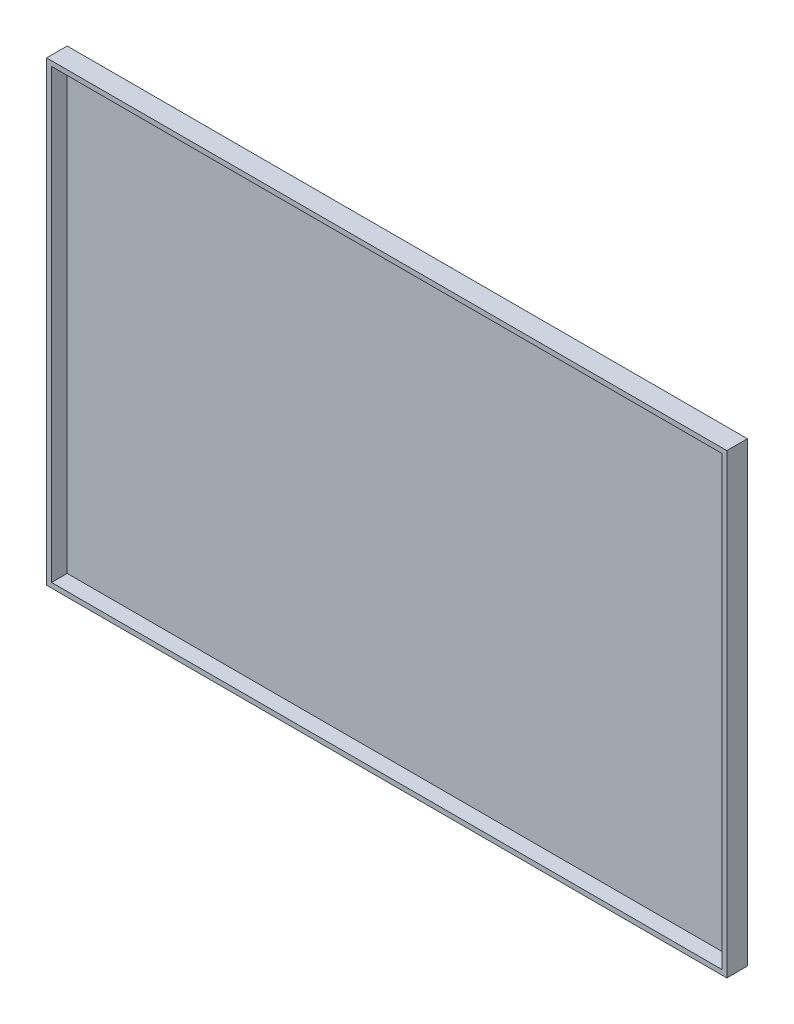
ISO-10303-21;
HEADER;
FILE_DESCRIPTION(('STEP AP214'),'2;1');
FILE_NAME('part.step','',(''),(''),'','','');
FILE_SCHEMA(('AUTOMOTIVE_DESIGN { 1 0 10303 214 1 1 1 1 }'));
ENDSEC;
DATA;
#1=APPLICATION_CONTEXT('core data for automotive mechanical design processes');
#2=APPLICATION_PROTOCOL_DEFINITION('international standard','automotive_design',2000,#1);
#3=PRODUCT_CONTEXT('',#1,'mechanical');
#4=PRODUCT('Part','Part','',(#3));
#5=PRODUCT_RELATED_PRODUCT_CATEGORY('part','',(#4));
#6=PRODUCT_DEFINITION_FORMATION('','',#4);
#7=PRODUCT_DEFINITION_CONTEXT('part definition',#1,'design');
#8=PRODUCT_DEFINITION('design','',#6,#7);
#9=PRODUCT_DEFINITION_SHAPE('','',#8);
#10=(LENGTH_UNIT() NAMED_UNIT(*) SI_UNIT(.MILLI.,.METRE.));
#11=(NAMED_UNIT(*) PLANE_ANGLE_UNIT() SI_UNIT($,.RADIAN.));
#12=(NAMED_UNIT(*) SI_UNIT($,.STERADIAN.) SOLID_ANGLE_UNIT());
#13=UNCERTAINTY_MEASURE_WITH_UNIT(LENGTH_MEASURE(1.E-05),#10,'distance_accuracy_value','');
#14=(GEOMETRIC_REPRESENTATION_CONTEXT(3) GLOBAL_UNCERTAINTY_ASSIGNED_CONTEXT((#13)) GLOBAL_UNIT_ASSIGNED_CONTEXT((#10,
#11,#12)) REPRESENTATION_CONTEXT('',''));
#15=CARTESIAN_POINT('',(0.,0.,0.));
#16=DIRECTION('',(0.,0.,1.));
#17=DIRECTION('',(1.,0.,0.));
#18=AXIS2_PLACEMENT_3D('',#15,#16,#17);
#19=CARTESIAN_POINT('',(-3241.27891156463,1394.34013605442,92.));
#20=DIRECTION('',(1.,0.,0.));
#21=DIRECTION('',(0.,0.,-1.));
#22=AXIS2_PLACEMENT_3D('',#19,#20,#21);
#23=PLANE('',#22);
#24=DIRECTION('',(0.,-1.,0.));
#25=VECTOR('',#24,1.);
#26=CARTESIAN_POINT('',(-3241.27891156463,1394.34013605442,0.));
#27=LINE('',#26,#25);
#28=CARTESIAN_POINT('',(-3241.27891156463,1394.34013605442,0.));
#29=VERTEX_POINT('',#28);
#30=CARTESIAN_POINT('',(-3241.27891156463,-649.659863945578,0.));
#31=VERTEX_POINT('',#30);
#32=EDGE_CURVE('E140',#29,#31,#27,.T.);
#33=ORIENTED_EDGE('',*,*,#32,.T.);
#34=DIRECTION('',(0.,0.,-1.));
#35=VECTOR('',#34,1.);
#36=CARTESIAN_POINT('',(-3241.27891156463,-649.659863945578,92.));
#37=LINE('',#36,#35);
#38=CARTESIAN_POINT('',(-3241.27891156463,-649.659863945578,92.));
#39=VERTEX_POINT('',#38);
#40=EDGE_CURVE('E11',#39,#31,#37,.T.);
#41=ORIENTED_EDGE('',*,*,#40,.F.);
#42=DIRECTION('',(0.,-1.,0.));
#43=VECTOR('',#42,1.);
#44=CARTESIAN_POINT('',(-3241.27891156463,1394.34013605442,92.));
#45=LINE('',#44,#43);
#46=CARTESIAN_POINT('',(-3241.27891156463,1394.34013605442,92.));
#47=VERTEX_POINT('',#46);
#48=EDGE_CURVE('E144',#47,#39,#45,.T.);
#49=ORIENTED_EDGE('',*,*,#48,.F.);
#50=DIRECTION('',(0.,0.,-1.));
#51=VECTOR('',#50,1.);
#52=CARTESIAN_POINT('',(-3241.27891156463,1394.34013605442,92.));
#53=LINE('',#52,#51);
#54=EDGE_CURVE('E150',#47,#29,#53,.T.);
#55=ORIENTED_EDGE('',*,*,#54,.T.);
#56=EDGE_LOOP('',(#33,#41,#49,#55));
#57=FACE_BOUND('',#56,.T.);
#58=ADVANCED_FACE('F32',(#57),#23,.F.);
#59=CARTESIAN_POINT('',(-3241.27891156463,-649.659863945578,92.));
#60=DIRECTION('',(0.,1.,0.));
#61=DIRECTION('',(0.,0.,1.));
#62=AXIS2_PLACEMENT_3D('',#59,#60,#61);
#63=PLANE('',#62);
#64=DIRECTION('',(1.,0.,0.));
#65=VECTOR('',#64,1.);
#66=CARTESIAN_POINT('',(-3241.27891156463,-649.659863945578,0.));
#67=LINE('',#66,#65);
#68=CARTESIAN_POINT('',(-197.278911564626,-649.659863945578,0.));
#69=VERTEX_POINT('',#68);
#70=EDGE_CURVE('E153',#31,#69,#67,.T.);
#71=ORIENTED_EDGE('',*,*,#70,.T.);
#72=DIRECTION('',(0.,0.,-1.));
#73=VECTOR('',#72,1.);
#74=CARTESIAN_POINT('',(-197.278911564626,-649.659863945578,92.));
#75=LINE('',#74,#73);
#76=CARTESIAN_POINT('',(-197.278911564626,-649.659863945578,92.));
#77=VERTEX_POINT('',#76);
#78=EDGE_CURVE('E39',#77,#69,#75,.T.);
#79=ORIENTED_EDGE('',*,*,#78,.F.);
#80=DIRECTION('',(1.,0.,0.));
#81=VECTOR('',#80,1.);
#82=CARTESIAN_POINT('',(-3241.27891156463,-649.659863945578,92.));
#83=LINE('',#82,#81);
#84=EDGE_CURVE('E83',#39,#77,#83,.T.);
#85=ORIENTED_EDGE('',*,*,#84,.F.);
#86=ORIENTED_EDGE('',*,*,#40,.T.);
#87=EDGE_LOOP('',(#71,#79,#85,#86));
#88=FACE_BOUND('',#87,.T.);
#89=ADVANCED_FACE('F182',(#88),#63,.F.);
#90=CARTESIAN_POINT('',(-197.278911564626,1394.34013605442,92.));
#91=DIRECTION('',(-1.,0.,0.));
#92=DIRECTION('',(0.,-1.,0.));
#93=AXIS2_PLACEMENT_3D('',#90,#91,#92);
#94=PLANE('',#93);
#95=DIRECTION('',(0.,1.,0.));
#96=VECTOR('',#95,1.);
#97=CARTESIAN_POINT('',(-197.278911564626,1394.34013605442,0.));
#98=LINE('',#97,#96);
#99=CARTESIAN_POINT('',(-197.278911564626,1394.34013605442,0.));
#100=VERTEX_POINT('',#99);
#101=EDGE_CURVE('E155',#69,#100,#98,.T.);
#102=ORIENTED_EDGE('',*,*,#101,.T.);
#103=DIRECTION('',(0.,0.,-1.));
#104=VECTOR('',#103,1.);
#105=CARTESIAN_POINT('',(-197.278911564626,1394.34013605442,92.));
#106=LINE('',#105,#104);
#107=CARTESIAN_POINT('',(-197.278911564626,1394.34013605442,92.));
#108=VERTEX_POINT('',#107);
#109=EDGE_CURVE('E159',#108,#100,#106,.T.);
#110=ORIENTED_EDGE('',*,*,#109,.F.);
#111=DIRECTION('',(0.,1.,0.));
#112=VECTOR('',#111,1.);
#113=CARTESIAN_POINT('',(-197.278911564626,1394.34013605442,92.));
#114=LINE('',#113,#112);
#115=EDGE_CURVE('E147',#77,#108,#114,.T.);
#116=ORIENTED_EDGE('',*,*,#115,.F.);
#117=ORIENTED_EDGE('',*,*,#78,.T.);
#118=EDGE_LOOP('',(#102,#110,#116,#117));
#119=FACE_BOUND('',#118,.T.);
#120=ADVANCED_FACE('F164',(#119),#94,.F.);
#121=CARTESIAN_POINT('',(-3241.27891156463,1394.34013605442,92.));
#122=DIRECTION('',(0.,-1.,0.));
#123=DIRECTION('',(0.,0.,-1.));
#124=AXIS2_PLACEMENT_3D('',#121,#122,#123);
#125=PLANE('',#124);
#126=DIRECTION('',(-1.,0.,0.));
#127=VECTOR('',#126,1.);
#128=CARTESIAN_POINT('',(-3241.27891156463,1394.34013605442,0.));
#129=LINE('',#128,#127);
#130=EDGE_CURVE('E76',#100,#29,#129,.T.);
#131=ORIENTED_EDGE('',*,*,#130,.T.);
#132=ORIENTED_EDGE('',*,*,#54,.F.);
#133=DIRECTION('',(-1.,0.,0.));
#134=VECTOR('',#133,1.);
#135=CARTESIAN_POINT('',(-3241.27891156463,1394.34013605442,92.));
#136=LINE('',#135,#134);
#137=EDGE_CURVE('E55',#108,#47,#136,.T.);
#138=ORIENTED_EDGE('',*,*,#137,.F.);
#139=ORIENTED_EDGE('',*,*,#109,.T.);
#140=EDGE_LOOP('',(#131,#132,#138,#139));
#141=FACE_BOUND('',#140,.T.);
#142=ADVANCED_FACE('F172',(#141),#125,.F.);
#143=CARTESIAN_POINT('',(0.,0.,92.));
#144=DIRECTION('',(0.,0.,1.));
#145=DIRECTION('',(1.,0.,0.));
#146=AXIS2_PLACEMENT_3D('',#143,#144,#145);
#147=PLANE('',#146);
#148=DIRECTION('',(0.,-1.,0.));
#149=VECTOR('',#148,1.);
#150=CARTESIAN_POINT('',(-3219.27891156463,1372.34013605442,92.));
#151=LINE('',#150,#149);
#152=CARTESIAN_POINT('',(-3219.27891156463,1372.34013605442,92.));
#153=VERTEX_POINT('',#152);
#154=CARTESIAN_POINT('',(-3219.27891156463,-627.659863945578,92.));
#155=VERTEX_POINT('',#154);
#156=EDGE_CURVE('E46',#153,#155,#151,.T.);
#157=ORIENTED_EDGE('',*,*,#156,.F.);
#158=DIRECTION('',(-1.,0.,0.));
#159=VECTOR('',#158,1.);
#160=CARTESIAN_POINT('',(-3219.27891156463,1372.34013605442,92.));
#161=LINE('',#160,#159);
#162=CARTESIAN_POINT('',(-219.278911564626,1372.34013605442,92.));
#163=VERTEX_POINT('',#162);
#164=EDGE_CURVE('E125',#163,#153,#161,.T.);
#165=ORIENTED_EDGE('',*,*,#164,.F.);
#166=DIRECTION('',(0.,1.,0.));
#167=VECTOR('',#166,1.);
#168=CARTESIAN_POINT('',(-219.278911564626,1372.34013605442,92.));
#169=LINE('',#168,#167);
#170=CARTESIAN_POINT('',(-219.278911564625,-627.659863945578,92.));
#171=VERTEX_POINT('',#170);
#172=EDGE_CURVE('E128',#171,#163,#169,.T.);
#173=ORIENTED_EDGE('',*,*,#172,.F.);
#174=DIRECTION('',(1.,0.,0.));
#175=VECTOR('',#174,1.);
#176=CARTESIAN_POINT('',(-3219.27891156463,-627.659863945578,92.));
#177=LINE('',#176,#175);
#178=EDGE_CURVE('E134',#155,#171,#177,.T.);
#179=ORIENTED_EDGE('',*,*,#178,.F.);
#180=EDGE_LOOP('',(#157,#165,#173,#179));
#181=FACE_BOUND('',#180,.T.);
#182=ORIENTED_EDGE('',*,*,#48,.T.);
#183=ORIENTED_EDGE('',*,*,#84,.T.);
#184=ORIENTED_EDGE('',*,*,#115,.T.);
#185=ORIENTED_EDGE('',*,*,#137,.T.);
#186=EDGE_LOOP('',(#182,#183,#184,#185));
#187=FACE_BOUND('',#186,.T.);
#188=ADVANCED_FACE('F174',(#181,#187),#147,.T.);
#189=CARTESIAN_POINT('',(0.,0.,0.));
#190=DIRECTION('',(0.,0.,1.));
#191=DIRECTION('',(1.,0.,0.));
#192=AXIS2_PLACEMENT_3D('',#189,#190,#191);
#193=PLANE('',#192);
#194=ORIENTED_EDGE('',*,*,#32,.F.);
#195=ORIENTED_EDGE('',*,*,#130,.F.);
#196=ORIENTED_EDGE('',*,*,#101,.F.);
#197=ORIENTED_EDGE('',*,*,#70,.F.);
#198=EDGE_LOOP('',(#194,#195,#196,#197));
#199=FACE_BOUND('',#198,.T.);
#200=ADVANCED_FACE('F168',(#199),#193,.F.);
#201=CARTESIAN_POINT('',(-3219.27891156463,1372.34013605442,22.));
#202=DIRECTION('',(-1.,0.,0.));
#203=DIRECTION('',(0.,-1.,0.));
#204=AXIS2_PLACEMENT_3D('',#201,#202,#203);
#205=PLANE('',#204);
#206=ORIENTED_EDGE('',*,*,#156,.T.);
#207=DIRECTION('',(0.,0.,1.));
#208=VECTOR('',#207,1.);
#209=CARTESIAN_POINT('',(-3219.27891156463,-627.659863945578,22.));
#210=LINE('',#209,#208);
#211=CARTESIAN_POINT('',(-3219.27891156463,-627.659863945578,22.));
#212=VERTEX_POINT('',#211);
#213=EDGE_CURVE('E103',#212,#155,#210,.T.);
#214=ORIENTED_EDGE('',*,*,#213,.F.);
#215=DIRECTION('',(0.,-1.,0.));
#216=VECTOR('',#215,1.);
#217=CARTESIAN_POINT('',(-3219.27891156463,1372.34013605442,22.));
#218=LINE('',#217,#216);
#219=CARTESIAN_POINT('',(-3219.27891156463,1372.34013605442,22.));
#220=VERTEX_POINT('',#219);
#221=EDGE_CURVE('E107',#220,#212,#218,.T.);
#222=ORIENTED_EDGE('',*,*,#221,.F.);
#223=DIRECTION('',(0.,0.,1.));
#224=VECTOR('',#223,1.);
#225=CARTESIAN_POINT('',(-3219.27891156463,1372.34013605442,22.));
#226=LINE('',#225,#224);
#227=EDGE_CURVE('E138',#220,#153,#226,.T.);
#228=ORIENTED_EDGE('',*,*,#227,.T.);
#229=EDGE_LOOP('',(#206,#214,#222,#228));
#230=FACE_BOUND('',#229,.T.);
#231=ADVANCED_FACE('F105',(#230),#205,.F.);
#232=CARTESIAN_POINT('',(-3219.27891156463,1372.34013605442,22.));
#233=DIRECTION('',(0.,1.,0.));
#234=DIRECTION('',(-1.,0.,0.));
#235=AXIS2_PLACEMENT_3D('',#232,#233,#234);
#236=PLANE('',#235);
#237=ORIENTED_EDGE('',*,*,#164,.T.);
#238=ORIENTED_EDGE('',*,*,#227,.F.);
#239=DIRECTION('',(-1.,0.,0.));
#240=VECTOR('',#239,1.);
#241=CARTESIAN_POINT('',(-3219.27891156463,1372.34013605442,22.));
#242=LINE('',#241,#240);
#243=CARTESIAN_POINT('',(-219.278911564626,1372.34013605442,22.));
#244=VERTEX_POINT('',#243);
#245=EDGE_CURVE('E113',#244,#220,#242,.T.);
#246=ORIENTED_EDGE('',*,*,#245,.F.);
#247=DIRECTION('',(0.,0.,1.));
#248=VECTOR('',#247,1.);
#249=CARTESIAN_POINT('',(-219.278911564626,1372.34013605442,22.));
#250=LINE('',#249,#248);
#251=EDGE_CURVE('E141',#244,#163,#250,.T.);
#252=ORIENTED_EDGE('',*,*,#251,.T.);
#253=EDGE_LOOP('',(#237,#238,#246,#252));
#254=FACE_BOUND('',#253,.T.);
#255=ADVANCED_FACE('F221',(#254),#236,.F.);
#256=CARTESIAN_POINT('',(-219.278911564626,1372.34013605442,22.));
#257=DIRECTION('',(1.,0.,0.));
#258=DIRECTION('',(0.,1.,0.));
#259=AXIS2_PLACEMENT_3D('',#256,#257,#258);
#260=PLANE('',#259);
#261=ORIENTED_EDGE('',*,*,#172,.T.);
#262=ORIENTED_EDGE('',*,*,#251,.F.);
#263=DIRECTION('',(0.,1.,0.));
#264=VECTOR('',#263,1.);
#265=CARTESIAN_POINT('',(-219.278911564626,1372.34013605442,22.));
#266=LINE('',#265,#264);
#267=CARTESIAN_POINT('',(-219.278911564625,-627.659863945578,22.));
#268=VERTEX_POINT('',#267);
#269=EDGE_CURVE('E121',#268,#244,#266,.T.);
#270=ORIENTED_EDGE('',*,*,#269,.F.);
#271=DIRECTION('',(0.,0.,1.));
#272=VECTOR('',#271,1.);
#273=CARTESIAN_POINT('',(-219.278911564625,-627.659863945578,22.));
#274=LINE('',#273,#272);
#275=EDGE_CURVE('E112',#268,#171,#274,.T.);
#276=ORIENTED_EDGE('',*,*,#275,.T.);
#277=EDGE_LOOP('',(#261,#262,#270,#276));
#278=FACE_BOUND('',#277,.T.);
#279=ADVANCED_FACE('F230',(#278),#260,.F.);
#280=CARTESIAN_POINT('',(-3219.27891156463,-627.659863945578,22.));
#281=DIRECTION('',(0.,-1.,0.));
#282=DIRECTION('',(0.,0.,-1.));
#283=AXIS2_PLACEMENT_3D('',#280,#281,#282);
#284=PLANE('',#283);
#285=ORIENTED_EDGE('',*,*,#178,.T.);
#286=ORIENTED_EDGE('',*,*,#275,.F.);
#287=DIRECTION('',(1.,0.,0.));
#288=VECTOR('',#287,1.);
#289=CARTESIAN_POINT('',(-3219.27891156463,-627.659863945578,22.));
#290=LINE('',#289,#288);
#291=EDGE_CURVE('E116',#212,#268,#290,.T.);
#292=ORIENTED_EDGE('',*,*,#291,.F.);
#293=ORIENTED_EDGE('',*,*,#213,.T.);
#294=EDGE_LOOP('',(#285,#286,#292,#293));
#295=FACE_BOUND('',#294,.T.);
#296=ADVANCED_FACE('F117',(#295),#284,.F.);
#297=CARTESIAN_POINT('',(0.,0.,22.));
#298=DIRECTION('',(0.,0.,1.));
#299=DIRECTION('',(1.,0.,0.));
#300=AXIS2_PLACEMENT_3D('',#297,#298,#299);
#301=PLANE('',#300);
#302=ORIENTED_EDGE('',*,*,#221,.T.);
#303=ORIENTED_EDGE('',*,*,#291,.T.);
#304=ORIENTED_EDGE('',*,*,#269,.T.);
#305=ORIENTED_EDGE('',*,*,#245,.T.);
#306=EDGE_LOOP('',(#302,#303,#304,#305));
#307=FACE_BOUND('',#306,.T.);
#308=ADVANCED_FACE('F123',(#307),#301,.T.);
#309=CLOSED_SHELL('',(#58,#89,#120,#142,#188,#200,#231,#255,#279,#296,#308));
#310=MANIFOLD_SOLID_BREP('B2',#309);
#311=ADVANCED_BREP_SHAPE_REPRESENTATION('',(#18,#310),#14);
#312=SHAPE_DEFINITION_REPRESENTATION(#9,#311);
ENDSEC;
END-ISO-10303-21;
